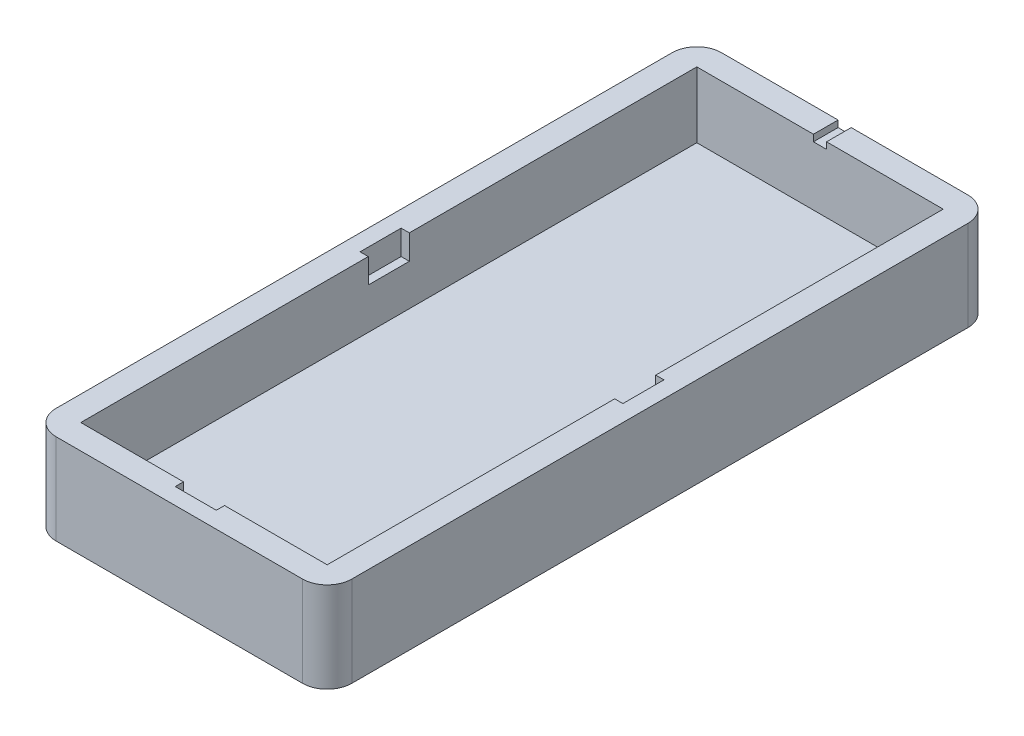
ISO-10303-21;
HEADER;
FILE_DESCRIPTION(('STEP AP214'),'2;1');
FILE_NAME('part.step','',(''),(''),'','','');
FILE_SCHEMA(('AUTOMOTIVE_DESIGN { 1 0 10303 214 1 1 1 1 }'));
ENDSEC;
DATA;
#1=APPLICATION_CONTEXT('core data for automotive mechanical design processes');
#2=APPLICATION_PROTOCOL_DEFINITION('international standard','automotive_design',2000,#1);
#3=PRODUCT_CONTEXT('',#1,'mechanical');
#4=PRODUCT('Part','Part','',(#3));
#5=PRODUCT_RELATED_PRODUCT_CATEGORY('part','',(#4));
#6=PRODUCT_DEFINITION_FORMATION('','',#4);
#7=PRODUCT_DEFINITION_CONTEXT('part definition',#1,'design');
#8=PRODUCT_DEFINITION('design','',#6,#7);
#9=PRODUCT_DEFINITION_SHAPE('','',#8);
#10=(LENGTH_UNIT() NAMED_UNIT(*) SI_UNIT(.MILLI.,.METRE.));
#11=(NAMED_UNIT(*) PLANE_ANGLE_UNIT() SI_UNIT($,.RADIAN.));
#12=(NAMED_UNIT(*) SI_UNIT($,.STERADIAN.) SOLID_ANGLE_UNIT());
#13=UNCERTAINTY_MEASURE_WITH_UNIT(LENGTH_MEASURE(1.E-05),#10,'distance_accuracy_value','');
#14=(GEOMETRIC_REPRESENTATION_CONTEXT(3) GLOBAL_UNCERTAINTY_ASSIGNED_CONTEXT((#13)) GLOBAL_UNIT_ASSIGNED_CONTEXT((#10,
#11,#12)) REPRESENTATION_CONTEXT('',''));
#15=CARTESIAN_POINT('',(0.,0.,0.));
#16=DIRECTION('',(0.,0.,1.));
#17=DIRECTION('',(1.,0.,0.));
#18=AXIS2_PLACEMENT_3D('',#15,#16,#17);
#19=CARTESIAN_POINT('',(0.,11.,0.));
#20=DIRECTION('',(1.,0.,0.));
#21=DIRECTION('',(0.,0.,-1.));
#22=AXIS2_PLACEMENT_3D('',#19,#20,#21);
#23=PLANE('',#22);
#24=DIRECTION('',(0.,0.,1.));
#25=VECTOR('',#24,1.);
#26=CARTESIAN_POINT('',(0.,0.,0.));
#27=LINE('',#26,#25);
#28=CARTESIAN_POINT('',(0.,0.,-78.));
#29=VERTEX_POINT('',#28);
#30=CARTESIAN_POINT('',(0.,0.,-3.));
#31=VERTEX_POINT('',#30);
#32=EDGE_CURVE('E411',#29,#31,#27,.T.);
#33=ORIENTED_EDGE('',*,*,#32,.T.);
#34=DIRECTION('',(0.,-1.,0.));
#35=VECTOR('',#34,1.);
#36=CARTESIAN_POINT('',(0.,11.,-3.));
#37=LINE('',#36,#35);
#38=CARTESIAN_POINT('',(0.,11.,-3.));
#39=VERTEX_POINT('',#38);
#40=EDGE_CURVE('E478',#31,#39,#37,.F.);
#41=ORIENTED_EDGE('',*,*,#40,.T.);
#42=DIRECTION('',(0.,0.,1.));
#43=VECTOR('',#42,1.);
#44=CARTESIAN_POINT('',(0.,11.,0.));
#45=LINE('',#44,#43);
#46=CARTESIAN_POINT('',(0.,11.,-78.));
#47=VERTEX_POINT('',#46);
#48=EDGE_CURVE('E423',#47,#39,#45,.T.);
#49=ORIENTED_EDGE('',*,*,#48,.F.);
#50=DIRECTION('',(0.,-1.,0.));
#51=VECTOR('',#50,1.);
#52=CARTESIAN_POINT('',(0.,11.,-78.));
#53=LINE('',#52,#51);
#54=EDGE_CURVE('E474',#47,#29,#53,.T.);
#55=ORIENTED_EDGE('',*,*,#54,.T.);
#56=EDGE_LOOP('',(#33,#41,#49,#55));
#57=FACE_BOUND('',#56,.T.);
#58=ADVANCED_FACE('F39',(#57),#23,.F.);
#59=CARTESIAN_POINT('',(0.,11.,0.));
#60=DIRECTION('',(0.,0.,-1.));
#61=DIRECTION('',(-1.,0.,0.));
#62=AXIS2_PLACEMENT_3D('',#59,#60,#61);
#63=PLANE('',#62);
#64=DIRECTION('',(1.,0.,0.));
#65=VECTOR('',#64,1.);
#66=CARTESIAN_POINT('',(0.,11.,0.));
#67=LINE('',#66,#65);
#68=CARTESIAN_POINT('',(3.,11.,0.));
#69=VERTEX_POINT('',#68);
#70=CARTESIAN_POINT('',(33.,11.,0.));
#71=VERTEX_POINT('',#70);
#72=EDGE_CURVE('E427',#69,#71,#67,.T.);
#73=ORIENTED_EDGE('',*,*,#72,.F.);
#74=DIRECTION('',(0.,-1.,0.));
#75=VECTOR('',#74,1.);
#76=CARTESIAN_POINT('',(3.,11.,0.));
#77=LINE('',#76,#75);
#78=CARTESIAN_POINT('',(3.,0.,0.));
#79=VERTEX_POINT('',#78);
#80=EDGE_CURVE('E458',#69,#79,#77,.T.);
#81=ORIENTED_EDGE('',*,*,#80,.T.);
#82=DIRECTION('',(1.,0.,0.));
#83=VECTOR('',#82,1.);
#84=CARTESIAN_POINT('',(0.,0.,0.));
#85=LINE('',#84,#83);
#86=CARTESIAN_POINT('',(33.,0.,0.));
#87=VERTEX_POINT('',#86);
#88=EDGE_CURVE('E445',#79,#87,#85,.T.);
#89=ORIENTED_EDGE('',*,*,#88,.T.);
#90=DIRECTION('',(0.,-1.,0.));
#91=VECTOR('',#90,1.);
#92=CARTESIAN_POINT('',(33.,11.,0.));
#93=LINE('',#92,#91);
#94=EDGE_CURVE('E441',#87,#71,#93,.F.);
#95=ORIENTED_EDGE('',*,*,#94,.T.);
#96=EDGE_LOOP('',(#73,#81,#89,#95));
#97=FACE_BOUND('',#96,.T.);
#98=ADVANCED_FACE('F525',(#97),#63,.F.);
#99=CARTESIAN_POINT('',(36.,11.,0.));
#100=DIRECTION('',(-1.,0.,0.));
#101=DIRECTION('',(0.,0.,1.));
#102=AXIS2_PLACEMENT_3D('',#99,#100,#101);
#103=PLANE('',#102);
#104=DIRECTION('',(0.,0.,-1.));
#105=VECTOR('',#104,1.);
#106=CARTESIAN_POINT('',(36.,11.,0.));
#107=LINE('',#106,#105);
#108=CARTESIAN_POINT('',(36.,11.,-3.));
#109=VERTEX_POINT('',#108);
#110=CARTESIAN_POINT('',(36.,11.,-78.));
#111=VERTEX_POINT('',#110);
#112=EDGE_CURVE('E432',#109,#111,#107,.T.);
#113=ORIENTED_EDGE('',*,*,#112,.F.);
#114=DIRECTION('',(0.,-1.,0.));
#115=VECTOR('',#114,1.);
#116=CARTESIAN_POINT('',(36.,11.,-3.));
#117=LINE('',#116,#115);
#118=CARTESIAN_POINT('',(36.,0.,-3.));
#119=VERTEX_POINT('',#118);
#120=EDGE_CURVE('E496',#109,#119,#117,.T.);
#121=ORIENTED_EDGE('',*,*,#120,.T.);
#122=DIRECTION('',(0.,0.,-1.));
#123=VECTOR('',#122,1.);
#124=CARTESIAN_POINT('',(36.,0.,0.));
#125=LINE('',#124,#123);
#126=CARTESIAN_POINT('',(36.,0.,-78.));
#127=VERTEX_POINT('',#126);
#128=EDGE_CURVE('E449',#119,#127,#125,.T.);
#129=ORIENTED_EDGE('',*,*,#128,.T.);
#130=DIRECTION('',(0.,-1.,0.));
#131=VECTOR('',#130,1.);
#132=CARTESIAN_POINT('',(36.,11.,-78.));
#133=LINE('',#132,#131);
#134=EDGE_CURVE('E493',#127,#111,#133,.F.);
#135=ORIENTED_EDGE('',*,*,#134,.T.);
#136=EDGE_LOOP('',(#113,#121,#129,#135));
#137=FACE_BOUND('',#136,.T.);
#138=ADVANCED_FACE('F534',(#137),#103,.F.);
#139=CARTESIAN_POINT('',(0.,11.,-81.));
#140=DIRECTION('',(0.,0.,1.));
#141=DIRECTION('',(1.,0.,0.));
#142=AXIS2_PLACEMENT_3D('',#139,#140,#141);
#143=PLANE('',#142);
#144=DIRECTION('',(-1.,0.,0.));
#145=VECTOR('',#144,1.);
#146=CARTESIAN_POINT('',(0.,11.,-81.));
#147=LINE('',#146,#145);
#148=CARTESIAN_POINT('',(17.2,11.,-81.));
#149=VERTEX_POINT('',#148);
#150=CARTESIAN_POINT('',(3.,11.,-81.));
#151=VERTEX_POINT('',#150);
#152=EDGE_CURVE('E436',#149,#151,#147,.T.);
#153=ORIENTED_EDGE('',*,*,#152,.F.);
#154=DIRECTION('',(0.,1.,0.));
#155=VECTOR('',#154,1.);
#156=CARTESIAN_POINT('',(17.2,10.2,-81.));
#157=LINE('',#156,#155);
#158=CARTESIAN_POINT('',(17.2,10.2,-81.));
#159=VERTEX_POINT('',#158);
#160=EDGE_CURVE('E360',#159,#149,#157,.T.);
#161=ORIENTED_EDGE('',*,*,#160,.F.);
#162=DIRECTION('',(-1.,0.,0.));
#163=VECTOR('',#162,1.);
#164=CARTESIAN_POINT('',(17.2,10.2,-81.));
#165=LINE('',#164,#163);
#166=CARTESIAN_POINT('',(18.8,10.2,-81.));
#167=VERTEX_POINT('',#166);
#168=EDGE_CURVE('E349',#167,#159,#165,.T.);
#169=ORIENTED_EDGE('',*,*,#168,.F.);
#170=DIRECTION('',(0.,1.,0.));
#171=VECTOR('',#170,1.);
#172=CARTESIAN_POINT('',(18.8,10.2,-81.));
#173=LINE('',#172,#171);
#174=CARTESIAN_POINT('',(18.8,11.,-81.));
#175=VERTEX_POINT('',#174);
#176=EDGE_CURVE('E364',#167,#175,#173,.T.);
#177=ORIENTED_EDGE('',*,*,#176,.T.);
#178=CARTESIAN_POINT('',(33.,11.,-81.));
#179=VERTEX_POINT('',#178);
#180=EDGE_CURVE('E437',#179,#175,#147,.T.);
#181=ORIENTED_EDGE('',*,*,#180,.F.);
#182=DIRECTION('',(0.,-1.,0.));
#183=VECTOR('',#182,1.);
#184=CARTESIAN_POINT('',(33.,11.,-81.));
#185=LINE('',#184,#183);
#186=CARTESIAN_POINT('',(33.,0.,-81.));
#187=VERTEX_POINT('',#186);
#188=EDGE_CURVE('E11',#179,#187,#185,.T.);
#189=ORIENTED_EDGE('',*,*,#188,.T.);
#190=DIRECTION('',(-1.,0.,0.));
#191=VECTOR('',#190,1.);
#192=CARTESIAN_POINT('',(0.,0.,-81.));
#193=LINE('',#192,#191);
#194=CARTESIAN_POINT('',(3.,0.,-81.));
#195=VERTEX_POINT('',#194);
#196=EDGE_CURVE('E428',#187,#195,#193,.T.);
#197=ORIENTED_EDGE('',*,*,#196,.T.);
#198=DIRECTION('',(0.,-1.,0.));
#199=VECTOR('',#198,1.);
#200=CARTESIAN_POINT('',(3.,11.,-81.));
#201=LINE('',#200,#199);
#202=EDGE_CURVE('E48',#195,#151,#201,.F.);
#203=ORIENTED_EDGE('',*,*,#202,.T.);
#204=EDGE_LOOP('',(#153,#161,#169,#177,#181,#189,#197,#203));
#205=FACE_BOUND('',#204,.T.);
#206=ADVANCED_FACE('F505',(#205),#143,.F.);
#207=CARTESIAN_POINT('',(0.,11.,0.));
#208=DIRECTION('',(0.,-1.,0.));
#209=DIRECTION('',(0.,0.,-1.));
#210=AXIS2_PLACEMENT_3D('',#207,#208,#209);
#211=PLANE('',#210);
#212=DIRECTION('',(0.,0.,1.));
#213=VECTOR('',#212,1.);
#214=CARTESIAN_POINT('',(3.,11.,-3.));
#215=LINE('',#214,#213);
#216=CARTESIAN_POINT('',(3.,11.,-38.));
#217=VERTEX_POINT('',#216);
#218=CARTESIAN_POINT('',(3.,11.,-3.));
#219=VERTEX_POINT('',#218);
#220=EDGE_CURVE('E363',#217,#219,#215,.T.);
#221=ORIENTED_EDGE('',*,*,#220,.F.);
#222=DIRECTION('',(1.,0.,0.));
#223=VECTOR('',#222,1.);
#224=CARTESIAN_POINT('',(3.,11.,-38.));
#225=LINE('',#224,#223);
#226=CARTESIAN_POINT('',(2.,11.,-38.));
#227=VERTEX_POINT('',#226);
#228=EDGE_CURVE('E245',#227,#217,#225,.T.);
#229=ORIENTED_EDGE('',*,*,#228,.F.);
#230=DIRECTION('',(0.,0.,1.));
#231=VECTOR('',#230,1.);
#232=CARTESIAN_POINT('',(2.,11.,-43.));
#233=LINE('',#232,#231);
#234=CARTESIAN_POINT('',(2.,11.,-43.));
#235=VERTEX_POINT('',#234);
#236=EDGE_CURVE('E569',#235,#227,#233,.T.);
#237=ORIENTED_EDGE('',*,*,#236,.F.);
#238=DIRECTION('',(-1.,0.,0.));
#239=VECTOR('',#238,1.);
#240=CARTESIAN_POINT('',(3.,11.,-43.));
#241=LINE('',#240,#239);
#242=CARTESIAN_POINT('',(3.,11.,-43.));
#243=VERTEX_POINT('',#242);
#244=EDGE_CURVE('E290',#243,#235,#241,.T.);
#245=ORIENTED_EDGE('',*,*,#244,.F.);
#246=CARTESIAN_POINT('',(3.,11.,-78.));
#247=VERTEX_POINT('',#246);
#248=EDGE_CURVE('E251',#247,#243,#215,.T.);
#249=ORIENTED_EDGE('',*,*,#248,.F.);
#250=DIRECTION('',(-1.,0.,0.));
#251=VECTOR('',#250,1.);
#252=CARTESIAN_POINT('',(3.,11.,-78.));
#253=LINE('',#252,#251);
#254=CARTESIAN_POINT('',(17.2,11.,-78.));
#255=VERTEX_POINT('',#254);
#256=EDGE_CURVE('E404',#255,#247,#253,.T.);
#257=ORIENTED_EDGE('',*,*,#256,.F.);
#258=DIRECTION('',(0.,0.,1.));
#259=VECTOR('',#258,1.);
#260=CARTESIAN_POINT('',(17.2,11.,-81.));
#261=LINE('',#260,#259);
#262=EDGE_CURVE('E354',#149,#255,#261,.T.);
#263=ORIENTED_EDGE('',*,*,#262,.F.);
#264=ORIENTED_EDGE('',*,*,#152,.T.);
#265=CARTESIAN_POINT('',(3.,11.,-78.));
#266=DIRECTION('',(0.,-1.,0.));
#267=DIRECTION('',(0.,0.,-1.));
#268=AXIS2_PLACEMENT_3D('',#265,#266,#267);
#269=CIRCLE('',#268,3.);
#270=EDGE_CURVE('E481',#151,#47,#269,.F.);
#271=ORIENTED_EDGE('',*,*,#270,.T.);
#272=ORIENTED_EDGE('',*,*,#48,.T.);
#273=CARTESIAN_POINT('',(3.,11.,-3.));
#274=DIRECTION('',(0.,-1.,0.));
#275=DIRECTION('',(0.,0.,-1.));
#276=AXIS2_PLACEMENT_3D('',#273,#274,#275);
#277=CIRCLE('',#276,3.);
#278=EDGE_CURVE('E490',#39,#69,#277,.F.);
#279=ORIENTED_EDGE('',*,*,#278,.T.);
#280=ORIENTED_EDGE('',*,*,#72,.T.);
#281=CARTESIAN_POINT('',(33.,11.,-3.));
#282=DIRECTION('',(0.,-1.,0.));
#283=DIRECTION('',(0.,0.,-1.));
#284=AXIS2_PLACEMENT_3D('',#281,#282,#283);
#285=CIRCLE('',#284,3.);
#286=EDGE_CURVE('E487',#71,#109,#285,.F.);
#287=ORIENTED_EDGE('',*,*,#286,.T.);
#288=ORIENTED_EDGE('',*,*,#112,.T.);
#289=CARTESIAN_POINT('',(33.,11.,-78.));
#290=DIRECTION('',(0.,-1.,0.));
#291=DIRECTION('',(0.,0.,-1.));
#292=AXIS2_PLACEMENT_3D('',#289,#290,#291);
#293=CIRCLE('',#292,3.);
#294=EDGE_CURVE('E484',#111,#179,#293,.F.);
#295=ORIENTED_EDGE('',*,*,#294,.T.);
#296=ORIENTED_EDGE('',*,*,#180,.T.);
#297=DIRECTION('',(0.,0.,-1.));
#298=VECTOR('',#297,1.);
#299=CARTESIAN_POINT('',(18.8,11.,-81.));
#300=LINE('',#299,#298);
#301=CARTESIAN_POINT('',(18.8,11.,-78.));
#302=VERTEX_POINT('',#301);
#303=EDGE_CURVE('E341',#302,#175,#300,.T.);
#304=ORIENTED_EDGE('',*,*,#303,.F.);
#305=CARTESIAN_POINT('',(33.,11.,-78.));
#306=VERTEX_POINT('',#305);
#307=EDGE_CURVE('E379',#306,#302,#253,.T.);
#308=ORIENTED_EDGE('',*,*,#307,.F.);
#309=DIRECTION('',(0.,0.,-1.));
#310=VECTOR('',#309,1.);
#311=CARTESIAN_POINT('',(33.,11.,-3.));
#312=LINE('',#311,#310);
#313=CARTESIAN_POINT('',(33.,11.,-43.));
#314=VERTEX_POINT('',#313);
#315=EDGE_CURVE('E399',#314,#306,#312,.T.);
#316=ORIENTED_EDGE('',*,*,#315,.F.);
#317=DIRECTION('',(-1.,0.,0.));
#318=VECTOR('',#317,1.);
#319=CARTESIAN_POINT('',(33.,11.,-43.));
#320=LINE('',#319,#318);
#321=CARTESIAN_POINT('',(34.,11.,-43.));
#322=VERTEX_POINT('',#321);
#323=EDGE_CURVE('E265',#322,#314,#320,.T.);
#324=ORIENTED_EDGE('',*,*,#323,.F.);
#325=DIRECTION('',(0.,0.,-1.));
#326=VECTOR('',#325,1.);
#327=CARTESIAN_POINT('',(34.,11.,-43.));
#328=LINE('',#327,#326);
#329=CARTESIAN_POINT('',(34.,11.,-38.));
#330=VERTEX_POINT('',#329);
#331=EDGE_CURVE('E279',#330,#322,#328,.T.);
#332=ORIENTED_EDGE('',*,*,#331,.F.);
#333=DIRECTION('',(1.,0.,0.));
#334=VECTOR('',#333,1.);
#335=CARTESIAN_POINT('',(33.,11.,-38.));
#336=LINE('',#335,#334);
#337=CARTESIAN_POINT('',(33.,11.,-38.));
#338=VERTEX_POINT('',#337);
#339=EDGE_CURVE('E275',#338,#330,#336,.T.);
#340=ORIENTED_EDGE('',*,*,#339,.F.);
#341=CARTESIAN_POINT('',(33.,11.,-3.));
#342=VERTEX_POINT('',#341);
#343=EDGE_CURVE('E400',#342,#338,#312,.T.);
#344=ORIENTED_EDGE('',*,*,#343,.F.);
#345=DIRECTION('',(1.,0.,0.));
#346=VECTOR('',#345,1.);
#347=CARTESIAN_POINT('',(3.,11.,-3.));
#348=LINE('',#347,#346);
#349=CARTESIAN_POINT('',(20.5,11.,-3.));
#350=VERTEX_POINT('',#349);
#351=EDGE_CURVE('E394',#350,#342,#348,.T.);
#352=ORIENTED_EDGE('',*,*,#351,.F.);
#353=DIRECTION('',(0.,0.,-1.));
#354=VECTOR('',#353,1.);
#355=CARTESIAN_POINT('',(20.5,11.,-3.));
#356=LINE('',#355,#354);
#357=CARTESIAN_POINT('',(20.5,11.,-2.));
#358=VERTEX_POINT('',#357);
#359=EDGE_CURVE('E304',#358,#350,#356,.T.);
#360=ORIENTED_EDGE('',*,*,#359,.F.);
#361=DIRECTION('',(1.,0.,0.));
#362=VECTOR('',#361,1.);
#363=CARTESIAN_POINT('',(15.5,11.,-2.));
#364=LINE('',#363,#362);
#365=CARTESIAN_POINT('',(15.5,11.,-2.));
#366=VERTEX_POINT('',#365);
#367=EDGE_CURVE('E320',#366,#358,#364,.T.);
#368=ORIENTED_EDGE('',*,*,#367,.F.);
#369=DIRECTION('',(0.,0.,1.));
#370=VECTOR('',#369,1.);
#371=CARTESIAN_POINT('',(15.5,11.,-3.));
#372=LINE('',#371,#370);
#373=CARTESIAN_POINT('',(15.5,11.,-3.));
#374=VERTEX_POINT('',#373);
#375=EDGE_CURVE('E316',#374,#366,#372,.T.);
#376=ORIENTED_EDGE('',*,*,#375,.F.);
#377=EDGE_CURVE('E395',#219,#374,#348,.T.);
#378=ORIENTED_EDGE('',*,*,#377,.F.);
#379=EDGE_LOOP('',(#221,#229,#237,#245,#249,#257,#263,#264,#271,#272,#279,#280,#287,#288,#295,
#296,#304,#308,#316,#324,#332,#340,#344,#352,#360,#368,#376,#378));
#380=FACE_BOUND('',#379,.T.);
#381=ADVANCED_FACE('F513',(#380),#211,.F.);
#382=CARTESIAN_POINT('',(0.,0.,0.));
#383=DIRECTION('',(0.,-1.,0.));
#384=DIRECTION('',(0.,0.,-1.));
#385=AXIS2_PLACEMENT_3D('',#382,#383,#384);
#386=PLANE('',#385);
#387=ORIENTED_EDGE('',*,*,#88,.F.);
#388=CARTESIAN_POINT('',(3.,0.,-3.));
#389=DIRECTION('',(0.,-1.,0.));
#390=DIRECTION('',(0.,0.,-1.));
#391=AXIS2_PLACEMENT_3D('',#388,#389,#390);
#392=CIRCLE('',#391,3.);
#393=EDGE_CURVE('E471',#79,#31,#392,.T.);
#394=ORIENTED_EDGE('',*,*,#393,.T.);
#395=ORIENTED_EDGE('',*,*,#32,.F.);
#396=CARTESIAN_POINT('',(3.,0.,-78.));
#397=DIRECTION('',(0.,-1.,0.));
#398=DIRECTION('',(0.,0.,-1.));
#399=AXIS2_PLACEMENT_3D('',#396,#397,#398);
#400=CIRCLE('',#399,3.);
#401=EDGE_CURVE('E462',#29,#195,#400,.T.);
#402=ORIENTED_EDGE('',*,*,#401,.T.);
#403=ORIENTED_EDGE('',*,*,#196,.F.);
#404=CARTESIAN_POINT('',(33.,0.,-78.));
#405=DIRECTION('',(0.,-1.,0.));
#406=DIRECTION('',(0.,0.,-1.));
#407=AXIS2_PLACEMENT_3D('',#404,#405,#406);
#408=CIRCLE('',#407,3.);
#409=EDGE_CURVE('E465',#187,#127,#408,.T.);
#410=ORIENTED_EDGE('',*,*,#409,.T.);
#411=ORIENTED_EDGE('',*,*,#128,.F.);
#412=CARTESIAN_POINT('',(33.,0.,-3.));
#413=DIRECTION('',(0.,-1.,0.));
#414=DIRECTION('',(0.,0.,-1.));
#415=AXIS2_PLACEMENT_3D('',#412,#413,#414);
#416=CIRCLE('',#415,3.);
#417=EDGE_CURVE('E468',#119,#87,#416,.T.);
#418=ORIENTED_EDGE('',*,*,#417,.T.);
#419=EDGE_LOOP('',(#387,#394,#395,#402,#403,#410,#411,#418));
#420=FACE_BOUND('',#419,.T.);
#421=ADVANCED_FACE('F642',(#420),#386,.T.);
#422=CARTESIAN_POINT('',(3.,3.,-3.));
#423=DIRECTION('',(-1.,0.,0.));
#424=DIRECTION('',(0.,0.,1.));
#425=AXIS2_PLACEMENT_3D('',#422,#423,#424);
#426=PLANE('',#425);
#427=DIRECTION('',(0.,0.,-1.));
#428=VECTOR('',#427,1.);
#429=CARTESIAN_POINT('',(3.,8.,-43.));
#430=LINE('',#429,#428);
#431=CARTESIAN_POINT('',(3.,8.,-38.));
#432=VERTEX_POINT('',#431);
#433=CARTESIAN_POINT('',(3.,8.,-43.));
#434=VERTEX_POINT('',#433);
#435=EDGE_CURVE('E238',#432,#434,#430,.T.);
#436=ORIENTED_EDGE('',*,*,#435,.F.);
#437=DIRECTION('',(0.,1.,0.));
#438=VECTOR('',#437,1.);
#439=CARTESIAN_POINT('',(3.,8.,-38.));
#440=LINE('',#439,#438);
#441=EDGE_CURVE('E357',#432,#217,#440,.T.);
#442=ORIENTED_EDGE('',*,*,#441,.T.);
#443=ORIENTED_EDGE('',*,*,#220,.T.);
#444=DIRECTION('',(0.,1.,0.));
#445=VECTOR('',#444,1.);
#446=CARTESIAN_POINT('',(3.,3.,-3.));
#447=LINE('',#446,#445);
#448=CARTESIAN_POINT('',(3.,3.,-3.));
#449=VERTEX_POINT('',#448);
#450=EDGE_CURVE('E391',#449,#219,#447,.T.);
#451=ORIENTED_EDGE('',*,*,#450,.F.);
#452=DIRECTION('',(0.,0.,1.));
#453=VECTOR('',#452,1.);
#454=CARTESIAN_POINT('',(3.,3.,-3.));
#455=LINE('',#454,#453);
#456=CARTESIAN_POINT('',(3.,3.,-78.));
#457=VERTEX_POINT('',#456);
#458=EDGE_CURVE('E374',#457,#449,#455,.T.);
#459=ORIENTED_EDGE('',*,*,#458,.F.);
#460=DIRECTION('',(0.,1.,0.));
#461=VECTOR('',#460,1.);
#462=CARTESIAN_POINT('',(3.,3.,-78.));
#463=LINE('',#462,#461);
#464=EDGE_CURVE('E408',#457,#247,#463,.T.);
#465=ORIENTED_EDGE('',*,*,#464,.T.);
#466=ORIENTED_EDGE('',*,*,#248,.T.);
#467=DIRECTION('',(0.,1.,0.));
#468=VECTOR('',#467,1.);
#469=CARTESIAN_POINT('',(3.,8.,-43.));
#470=LINE('',#469,#468);
#471=EDGE_CURVE('E232',#434,#243,#470,.T.);
#472=ORIENTED_EDGE('',*,*,#471,.F.);
#473=EDGE_LOOP('',(#436,#442,#443,#451,#459,#465,#466,#472));
#474=FACE_BOUND('',#473,.T.);
#475=ADVANCED_FACE('F248',(#474),#426,.F.);
#476=CARTESIAN_POINT('',(3.,3.,-78.));
#477=DIRECTION('',(0.,0.,-1.));
#478=DIRECTION('',(-1.,0.,0.));
#479=AXIS2_PLACEMENT_3D('',#476,#477,#478);
#480=PLANE('',#479);
#481=DIRECTION('',(1.,0.,0.));
#482=VECTOR('',#481,1.);
#483=CARTESIAN_POINT('',(17.2,10.2,-78.));
#484=LINE('',#483,#482);
#485=CARTESIAN_POINT('',(17.2,10.2,-78.));
#486=VERTEX_POINT('',#485);
#487=CARTESIAN_POINT('',(18.8,10.2,-78.));
#488=VERTEX_POINT('',#487);
#489=EDGE_CURVE('E340',#486,#488,#484,.T.);
#490=ORIENTED_EDGE('',*,*,#489,.F.);
#491=DIRECTION('',(0.,1.,0.));
#492=VECTOR('',#491,1.);
#493=CARTESIAN_POINT('',(17.2,10.2,-78.));
#494=LINE('',#493,#492);
#495=EDGE_CURVE('E353',#486,#255,#494,.T.);
#496=ORIENTED_EDGE('',*,*,#495,.T.);
#497=ORIENTED_EDGE('',*,*,#256,.T.);
#498=ORIENTED_EDGE('',*,*,#464,.F.);
#499=DIRECTION('',(-1.,0.,0.));
#500=VECTOR('',#499,1.);
#501=CARTESIAN_POINT('',(3.,3.,-78.));
#502=LINE('',#501,#500);
#503=CARTESIAN_POINT('',(33.,3.,-78.));
#504=VERTEX_POINT('',#503);
#505=EDGE_CURVE('E387',#504,#457,#502,.T.);
#506=ORIENTED_EDGE('',*,*,#505,.F.);
#507=DIRECTION('',(0.,1.,0.));
#508=VECTOR('',#507,1.);
#509=CARTESIAN_POINT('',(33.,3.,-78.));
#510=LINE('',#509,#508);
#511=EDGE_CURVE('E412',#504,#306,#510,.T.);
#512=ORIENTED_EDGE('',*,*,#511,.T.);
#513=ORIENTED_EDGE('',*,*,#307,.T.);
#514=DIRECTION('',(0.,1.,0.));
#515=VECTOR('',#514,1.);
#516=CARTESIAN_POINT('',(18.8,10.2,-78.));
#517=LINE('',#516,#515);
#518=EDGE_CURVE('E368',#488,#302,#517,.T.);
#519=ORIENTED_EDGE('',*,*,#518,.F.);
#520=EDGE_LOOP('',(#490,#496,#497,#498,#506,#512,#513,#519));
#521=FACE_BOUND('',#520,.T.);
#522=ADVANCED_FACE('F551',(#521),#480,.F.);
#523=CARTESIAN_POINT('',(33.,3.,-3.));
#524=DIRECTION('',(1.,0.,0.));
#525=DIRECTION('',(0.,0.,-1.));
#526=AXIS2_PLACEMENT_3D('',#523,#524,#525);
#527=PLANE('',#526);
#528=DIRECTION('',(0.,0.,1.));
#529=VECTOR('',#528,1.);
#530=CARTESIAN_POINT('',(33.,8.,-43.));
#531=LINE('',#530,#529);
#532=CARTESIAN_POINT('',(33.,8.,-43.));
#533=VERTEX_POINT('',#532);
#534=CARTESIAN_POINT('',(33.,8.,-38.));
#535=VERTEX_POINT('',#534);
#536=EDGE_CURVE('E261',#533,#535,#531,.T.);
#537=ORIENTED_EDGE('',*,*,#536,.F.);
#538=DIRECTION('',(0.,1.,0.));
#539=VECTOR('',#538,1.);
#540=CARTESIAN_POINT('',(33.,8.,-43.));
#541=LINE('',#540,#539);
#542=EDGE_CURVE('E286',#533,#314,#541,.T.);
#543=ORIENTED_EDGE('',*,*,#542,.T.);
#544=ORIENTED_EDGE('',*,*,#315,.T.);
#545=ORIENTED_EDGE('',*,*,#511,.F.);
#546=DIRECTION('',(0.,0.,-1.));
#547=VECTOR('',#546,1.);
#548=CARTESIAN_POINT('',(33.,3.,-3.));
#549=LINE('',#548,#547);
#550=CARTESIAN_POINT('',(33.,3.,-3.));
#551=VERTEX_POINT('',#550);
#552=EDGE_CURVE('E383',#551,#504,#549,.T.);
#553=ORIENTED_EDGE('',*,*,#552,.F.);
#554=DIRECTION('',(0.,1.,0.));
#555=VECTOR('',#554,1.);
#556=CARTESIAN_POINT('',(33.,3.,-3.));
#557=LINE('',#556,#555);
#558=EDGE_CURVE('E416',#551,#342,#557,.T.);
#559=ORIENTED_EDGE('',*,*,#558,.T.);
#560=ORIENTED_EDGE('',*,*,#343,.T.);
#561=DIRECTION('',(0.,1.,0.));
#562=VECTOR('',#561,1.);
#563=CARTESIAN_POINT('',(33.,8.,-38.));
#564=LINE('',#563,#562);
#565=EDGE_CURVE('E274',#535,#338,#564,.T.);
#566=ORIENTED_EDGE('',*,*,#565,.F.);
#567=EDGE_LOOP('',(#537,#543,#544,#545,#553,#559,#560,#566));
#568=FACE_BOUND('',#567,.T.);
#569=ADVANCED_FACE('F635',(#568),#527,.F.);
#570=CARTESIAN_POINT('',(3.,3.,-3.));
#571=DIRECTION('',(0.,0.,1.));
#572=DIRECTION('',(1.,0.,0.));
#573=AXIS2_PLACEMENT_3D('',#570,#571,#572);
#574=PLANE('',#573);
#575=ORIENTED_EDGE('',*,*,#377,.T.);
#576=DIRECTION('',(0.,1.,0.));
#577=VECTOR('',#576,1.);
#578=CARTESIAN_POINT('',(15.5,8.,-3.));
#579=LINE('',#578,#577);
#580=CARTESIAN_POINT('',(15.5,8.,-3.));
#581=VERTEX_POINT('',#580);
#582=EDGE_CURVE('E280',#581,#374,#579,.T.);
#583=ORIENTED_EDGE('',*,*,#582,.F.);
#584=DIRECTION('',(-1.,0.,0.));
#585=VECTOR('',#584,1.);
#586=CARTESIAN_POINT('',(15.5,8.,-3.));
#587=LINE('',#586,#585);
#588=CARTESIAN_POINT('',(20.5,8.,-3.));
#589=VERTEX_POINT('',#588);
#590=EDGE_CURVE('E311',#589,#581,#587,.T.);
#591=ORIENTED_EDGE('',*,*,#590,.F.);
#592=DIRECTION('',(0.,1.,0.));
#593=VECTOR('',#592,1.);
#594=CARTESIAN_POINT('',(20.5,8.,-3.));
#595=LINE('',#594,#593);
#596=EDGE_CURVE('E328',#589,#350,#595,.T.);
#597=ORIENTED_EDGE('',*,*,#596,.T.);
#598=ORIENTED_EDGE('',*,*,#351,.T.);
#599=ORIENTED_EDGE('',*,*,#558,.F.);
#600=DIRECTION('',(1.,0.,0.));
#601=VECTOR('',#600,1.);
#602=CARTESIAN_POINT('',(3.,3.,-3.));
#603=LINE('',#602,#601);
#604=EDGE_CURVE('E378',#449,#551,#603,.T.);
#605=ORIENTED_EDGE('',*,*,#604,.F.);
#606=ORIENTED_EDGE('',*,*,#450,.T.);
#607=EDGE_LOOP('',(#575,#583,#591,#597,#598,#599,#605,#606));
#608=FACE_BOUND('',#607,.T.);
#609=ADVANCED_FACE('F584',(#608),#574,.F.);
#610=CARTESIAN_POINT('',(0.,3.,0.));
#611=DIRECTION('',(0.,-1.,0.));
#612=DIRECTION('',(0.,0.,-1.));
#613=AXIS2_PLACEMENT_3D('',#610,#611,#612);
#614=PLANE('',#613);
#615=ORIENTED_EDGE('',*,*,#458,.T.);
#616=ORIENTED_EDGE('',*,*,#604,.T.);
#617=ORIENTED_EDGE('',*,*,#552,.T.);
#618=ORIENTED_EDGE('',*,*,#505,.T.);
#619=EDGE_LOOP('',(#615,#616,#617,#618));
#620=FACE_BOUND('',#619,.T.);
#621=ADVANCED_FACE('F590',(#620),#614,.F.);
#622=CARTESIAN_POINT('',(3.,11.,-3.));
#623=DIRECTION('',(0.,-1.,0.));
#624=DIRECTION('',(0.,0.,-1.));
#625=AXIS2_PLACEMENT_3D('',#622,#623,#624);
#626=CYLINDRICAL_SURFACE('',#625,3.);
#627=ORIENTED_EDGE('',*,*,#278,.F.);
#628=ORIENTED_EDGE('',*,*,#40,.F.);
#629=ORIENTED_EDGE('',*,*,#393,.F.);
#630=ORIENTED_EDGE('',*,*,#80,.F.);
#631=EDGE_LOOP('',(#627,#628,#629,#630));
#632=FACE_BOUND('',#631,.T.);
#633=ADVANCED_FACE('F520',(#632),#626,.T.);
#634=CARTESIAN_POINT('',(33.,11.,-3.));
#635=DIRECTION('',(0.,-1.,0.));
#636=DIRECTION('',(0.,0.,-1.));
#637=AXIS2_PLACEMENT_3D('',#634,#635,#636);
#638=CYLINDRICAL_SURFACE('',#637,3.);
#639=ORIENTED_EDGE('',*,*,#286,.F.);
#640=ORIENTED_EDGE('',*,*,#94,.F.);
#641=ORIENTED_EDGE('',*,*,#417,.F.);
#642=ORIENTED_EDGE('',*,*,#120,.F.);
#643=EDGE_LOOP('',(#639,#640,#641,#642));
#644=FACE_BOUND('',#643,.T.);
#645=ADVANCED_FACE('F529',(#644),#638,.T.);
#646=CARTESIAN_POINT('',(33.,11.,-78.));
#647=DIRECTION('',(0.,-1.,0.));
#648=DIRECTION('',(0.,0.,-1.));
#649=AXIS2_PLACEMENT_3D('',#646,#647,#648);
#650=CYLINDRICAL_SURFACE('',#649,3.);
#651=ORIENTED_EDGE('',*,*,#294,.F.);
#652=ORIENTED_EDGE('',*,*,#134,.F.);
#653=ORIENTED_EDGE('',*,*,#409,.F.);
#654=ORIENTED_EDGE('',*,*,#188,.F.);
#655=EDGE_LOOP('',(#651,#652,#653,#654));
#656=FACE_BOUND('',#655,.T.);
#657=ADVANCED_FACE('F538',(#656),#650,.T.);
#658=CARTESIAN_POINT('',(3.,11.,-78.));
#659=DIRECTION('',(0.,-1.,0.));
#660=DIRECTION('',(0.,0.,-1.));
#661=AXIS2_PLACEMENT_3D('',#658,#659,#660);
#662=CYLINDRICAL_SURFACE('',#661,3.);
#663=ORIENTED_EDGE('',*,*,#270,.F.);
#664=ORIENTED_EDGE('',*,*,#202,.F.);
#665=ORIENTED_EDGE('',*,*,#401,.F.);
#666=ORIENTED_EDGE('',*,*,#54,.F.);
#667=EDGE_LOOP('',(#663,#664,#665,#666));
#668=FACE_BOUND('',#667,.T.);
#669=ADVANCED_FACE('F41',(#668),#662,.T.);
#670=CARTESIAN_POINT('',(17.2,10.2,-81.));
#671=DIRECTION('',(-1.,0.,0.));
#672=DIRECTION('',(0.,0.,1.));
#673=AXIS2_PLACEMENT_3D('',#670,#671,#672);
#674=PLANE('',#673);
#675=ORIENTED_EDGE('',*,*,#262,.T.);
#676=ORIENTED_EDGE('',*,*,#495,.F.);
#677=DIRECTION('',(0.,0.,1.));
#678=VECTOR('',#677,1.);
#679=CARTESIAN_POINT('',(17.2,10.2,-81.));
#680=LINE('',#679,#678);
#681=EDGE_CURVE('E337',#159,#486,#680,.T.);
#682=ORIENTED_EDGE('',*,*,#681,.F.);
#683=ORIENTED_EDGE('',*,*,#160,.T.);
#684=EDGE_LOOP('',(#675,#676,#682,#683));
#685=FACE_BOUND('',#684,.T.);
#686=ADVANCED_FACE('F619',(#685),#674,.F.);
#687=CARTESIAN_POINT('',(18.8,10.2,-81.));
#688=DIRECTION('',(1.,0.,0.));
#689=DIRECTION('',(0.,0.,-1.));
#690=AXIS2_PLACEMENT_3D('',#687,#688,#689);
#691=PLANE('',#690);
#692=ORIENTED_EDGE('',*,*,#303,.T.);
#693=ORIENTED_EDGE('',*,*,#176,.F.);
#694=DIRECTION('',(0.,0.,-1.));
#695=VECTOR('',#694,1.);
#696=CARTESIAN_POINT('',(18.8,10.2,-81.));
#697=LINE('',#696,#695);
#698=EDGE_CURVE('E345',#488,#167,#697,.T.);
#699=ORIENTED_EDGE('',*,*,#698,.F.);
#700=ORIENTED_EDGE('',*,*,#518,.T.);
#701=EDGE_LOOP('',(#692,#693,#699,#700));
#702=FACE_BOUND('',#701,.T.);
#703=ADVANCED_FACE('F544',(#702),#691,.F.);
#704=CARTESIAN_POINT('',(0.,10.2,0.));
#705=DIRECTION('',(0.,1.,0.));
#706=DIRECTION('',(0.,0.,1.));
#707=AXIS2_PLACEMENT_3D('',#704,#705,#706);
#708=PLANE('',#707);
#709=ORIENTED_EDGE('',*,*,#681,.T.);
#710=ORIENTED_EDGE('',*,*,#489,.T.);
#711=ORIENTED_EDGE('',*,*,#698,.T.);
#712=ORIENTED_EDGE('',*,*,#168,.T.);
#713=EDGE_LOOP('',(#709,#710,#711,#712));
#714=FACE_BOUND('',#713,.T.);
#715=ADVANCED_FACE('F546',(#714),#708,.T.);
#716=CARTESIAN_POINT('',(15.5,8.,-3.));
#717=DIRECTION('',(-1.,0.,0.));
#718=DIRECTION('',(0.,0.,1.));
#719=AXIS2_PLACEMENT_3D('',#716,#717,#718);
#720=PLANE('',#719);
#721=ORIENTED_EDGE('',*,*,#375,.T.);
#722=DIRECTION('',(0.,1.,0.));
#723=VECTOR('',#722,1.);
#724=CARTESIAN_POINT('',(15.5,8.,-2.));
#725=LINE('',#724,#723);
#726=CARTESIAN_POINT('',(15.5,8.,-2.));
#727=VERTEX_POINT('',#726);
#728=EDGE_CURVE('E315',#727,#366,#725,.T.);
#729=ORIENTED_EDGE('',*,*,#728,.F.);
#730=DIRECTION('',(0.,0.,1.));
#731=VECTOR('',#730,1.);
#732=CARTESIAN_POINT('',(15.5,8.,-3.));
#733=LINE('',#732,#731);
#734=EDGE_CURVE('E299',#581,#727,#733,.T.);
#735=ORIENTED_EDGE('',*,*,#734,.F.);
#736=ORIENTED_EDGE('',*,*,#582,.T.);
#737=EDGE_LOOP('',(#721,#729,#735,#736));
#738=FACE_BOUND('',#737,.T.);
#739=ADVANCED_FACE('F722',(#738),#720,.F.);
#740=CARTESIAN_POINT('',(20.5,8.,-3.));
#741=DIRECTION('',(1.,0.,0.));
#742=DIRECTION('',(0.,0.,-1.));
#743=AXIS2_PLACEMENT_3D('',#740,#741,#742);
#744=PLANE('',#743);
#745=ORIENTED_EDGE('',*,*,#359,.T.);
#746=ORIENTED_EDGE('',*,*,#596,.F.);
#747=DIRECTION('',(0.,0.,-1.));
#748=VECTOR('',#747,1.);
#749=CARTESIAN_POINT('',(20.5,8.,-3.));
#750=LINE('',#749,#748);
#751=CARTESIAN_POINT('',(20.5,8.,-2.));
#752=VERTEX_POINT('',#751);
#753=EDGE_CURVE('E308',#752,#589,#750,.T.);
#754=ORIENTED_EDGE('',*,*,#753,.F.);
#755=DIRECTION('',(0.,1.,0.));
#756=VECTOR('',#755,1.);
#757=CARTESIAN_POINT('',(20.5,8.,-2.));
#758=LINE('',#757,#756);
#759=EDGE_CURVE('E332',#752,#358,#758,.T.);
#760=ORIENTED_EDGE('',*,*,#759,.T.);
#761=EDGE_LOOP('',(#745,#746,#754,#760));
#762=FACE_BOUND('',#761,.T.);
#763=ADVANCED_FACE('F728',(#762),#744,.F.);
#764=CARTESIAN_POINT('',(15.5,8.,-2.));
#765=DIRECTION('',(0.,0.,1.));
#766=DIRECTION('',(1.,0.,0.));
#767=AXIS2_PLACEMENT_3D('',#764,#765,#766);
#768=PLANE('',#767);
#769=ORIENTED_EDGE('',*,*,#367,.T.);
#770=ORIENTED_EDGE('',*,*,#759,.F.);
#771=DIRECTION('',(1.,0.,0.));
#772=VECTOR('',#771,1.);
#773=CARTESIAN_POINT('',(15.5,8.,-2.));
#774=LINE('',#773,#772);
#775=EDGE_CURVE('E303',#727,#752,#774,.T.);
#776=ORIENTED_EDGE('',*,*,#775,.F.);
#777=ORIENTED_EDGE('',*,*,#728,.T.);
#778=EDGE_LOOP('',(#769,#770,#776,#777));
#779=FACE_BOUND('',#778,.T.);
#780=ADVANCED_FACE('F737',(#779),#768,.F.);
#781=CARTESIAN_POINT('',(0.,8.,0.));
#782=DIRECTION('',(0.,1.,0.));
#783=DIRECTION('',(0.,0.,1.));
#784=AXIS2_PLACEMENT_3D('',#781,#782,#783);
#785=PLANE('',#784);
#786=ORIENTED_EDGE('',*,*,#734,.T.);
#787=ORIENTED_EDGE('',*,*,#775,.T.);
#788=ORIENTED_EDGE('',*,*,#753,.T.);
#789=ORIENTED_EDGE('',*,*,#590,.T.);
#790=EDGE_LOOP('',(#786,#787,#788,#789));
#791=FACE_BOUND('',#790,.T.);
#792=ADVANCED_FACE('F746',(#791),#785,.T.);
#793=CARTESIAN_POINT('',(33.,8.,-43.));
#794=DIRECTION('',(0.,0.,-1.));
#795=DIRECTION('',(-1.,0.,0.));
#796=AXIS2_PLACEMENT_3D('',#793,#794,#795);
#797=PLANE('',#796);
#798=ORIENTED_EDGE('',*,*,#323,.T.);
#799=ORIENTED_EDGE('',*,*,#542,.F.);
#800=DIRECTION('',(-1.,0.,0.));
#801=VECTOR('',#800,1.);
#802=CARTESIAN_POINT('',(33.,8.,-43.));
#803=LINE('',#802,#801);
#804=CARTESIAN_POINT('',(34.,8.,-43.));
#805=VERTEX_POINT('',#804);
#806=EDGE_CURVE('E63',#805,#533,#803,.T.);
#807=ORIENTED_EDGE('',*,*,#806,.F.);
#808=DIRECTION('',(0.,1.,0.));
#809=VECTOR('',#808,1.);
#810=CARTESIAN_POINT('',(34.,8.,-43.));
#811=LINE('',#810,#809);
#812=EDGE_CURVE('E291',#805,#322,#811,.T.);
#813=ORIENTED_EDGE('',*,*,#812,.T.);
#814=EDGE_LOOP('',(#798,#799,#807,#813));
#815=FACE_BOUND('',#814,.T.);
#816=ADVANCED_FACE('F755',(#815),#797,.F.);
#817=CARTESIAN_POINT('',(34.,8.,-43.));
#818=DIRECTION('',(1.,0.,0.));
#819=DIRECTION('',(0.,0.,-1.));
#820=AXIS2_PLACEMENT_3D('',#817,#818,#819);
#821=PLANE('',#820);
#822=ORIENTED_EDGE('',*,*,#331,.T.);
#823=ORIENTED_EDGE('',*,*,#812,.F.);
#824=DIRECTION('',(0.,0.,-1.));
#825=VECTOR('',#824,1.);
#826=CARTESIAN_POINT('',(34.,8.,-43.));
#827=LINE('',#826,#825);
#828=CARTESIAN_POINT('',(34.,8.,-38.));
#829=VERTEX_POINT('',#828);
#830=EDGE_CURVE('E269',#829,#805,#827,.T.);
#831=ORIENTED_EDGE('',*,*,#830,.F.);
#832=DIRECTION('',(0.,1.,0.));
#833=VECTOR('',#832,1.);
#834=CARTESIAN_POINT('',(34.,8.,-38.));
#835=LINE('',#834,#833);
#836=EDGE_CURVE('E294',#829,#330,#835,.T.);
#837=ORIENTED_EDGE('',*,*,#836,.T.);
#838=EDGE_LOOP('',(#822,#823,#831,#837));
#839=FACE_BOUND('',#838,.T.);
#840=ADVANCED_FACE('F764',(#839),#821,.F.);
#841=CARTESIAN_POINT('',(33.,8.,-38.));
#842=DIRECTION('',(0.,0.,1.));
#843=DIRECTION('',(1.,0.,0.));
#844=AXIS2_PLACEMENT_3D('',#841,#842,#843);
#845=PLANE('',#844);
#846=ORIENTED_EDGE('',*,*,#339,.T.);
#847=ORIENTED_EDGE('',*,*,#836,.F.);
#848=DIRECTION('',(1.,0.,0.));
#849=VECTOR('',#848,1.);
#850=CARTESIAN_POINT('',(33.,8.,-38.));
#851=LINE('',#850,#849);
#852=EDGE_CURVE('E264',#535,#829,#851,.T.);
#853=ORIENTED_EDGE('',*,*,#852,.F.);
#854=ORIENTED_EDGE('',*,*,#565,.T.);
#855=EDGE_LOOP('',(#846,#847,#853,#854));
#856=FACE_BOUND('',#855,.T.);
#857=ADVANCED_FACE('F773',(#856),#845,.F.);
#858=CARTESIAN_POINT('',(0.,8.,0.));
#859=DIRECTION('',(0.,1.,0.));
#860=DIRECTION('',(0.,0.,1.));
#861=AXIS2_PLACEMENT_3D('',#858,#859,#860);
#862=PLANE('',#861);
#863=ORIENTED_EDGE('',*,*,#536,.T.);
#864=ORIENTED_EDGE('',*,*,#852,.T.);
#865=ORIENTED_EDGE('',*,*,#830,.T.);
#866=ORIENTED_EDGE('',*,*,#806,.T.);
#867=EDGE_LOOP('',(#863,#864,#865,#866));
#868=FACE_BOUND('',#867,.T.);
#869=ADVANCED_FACE('F602',(#868),#862,.T.);
#870=CARTESIAN_POINT('',(3.,8.,-38.));
#871=DIRECTION('',(0.,0.,1.));
#872=DIRECTION('',(1.,0.,0.));
#873=AXIS2_PLACEMENT_3D('',#870,#871,#872);
#874=PLANE('',#873);
#875=ORIENTED_EDGE('',*,*,#228,.T.);
#876=ORIENTED_EDGE('',*,*,#441,.F.);
#877=DIRECTION('',(1.,0.,0.));
#878=VECTOR('',#877,1.);
#879=CARTESIAN_POINT('',(3.,8.,-38.));
#880=LINE('',#879,#878);
#881=CARTESIAN_POINT('',(2.,8.,-38.));
#882=VERTEX_POINT('',#881);
#883=EDGE_CURVE('E55',#882,#432,#880,.T.);
#884=ORIENTED_EDGE('',*,*,#883,.F.);
#885=DIRECTION('',(0.,1.,0.));
#886=VECTOR('',#885,1.);
#887=CARTESIAN_POINT('',(2.,8.,-38.));
#888=LINE('',#887,#886);
#889=EDGE_CURVE('E256',#882,#227,#888,.T.);
#890=ORIENTED_EDGE('',*,*,#889,.T.);
#891=EDGE_LOOP('',(#875,#876,#884,#890));
#892=FACE_BOUND('',#891,.T.);
#893=ADVANCED_FACE('F576',(#892),#874,.F.);
#894=CARTESIAN_POINT('',(2.,8.,-43.));
#895=DIRECTION('',(-1.,0.,0.));
#896=DIRECTION('',(0.,0.,1.));
#897=AXIS2_PLACEMENT_3D('',#894,#895,#896);
#898=PLANE('',#897);
#899=ORIENTED_EDGE('',*,*,#236,.T.);
#900=ORIENTED_EDGE('',*,*,#889,.F.);
#901=DIRECTION('',(0.,0.,1.));
#902=VECTOR('',#901,1.);
#903=CARTESIAN_POINT('',(2.,8.,-43.));
#904=LINE('',#903,#902);
#905=CARTESIAN_POINT('',(2.,8.,-43.));
#906=VERTEX_POINT('',#905);
#907=EDGE_CURVE('E237',#906,#882,#904,.T.);
#908=ORIENTED_EDGE('',*,*,#907,.F.);
#909=DIRECTION('',(0.,1.,0.));
#910=VECTOR('',#909,1.);
#911=CARTESIAN_POINT('',(2.,8.,-43.));
#912=LINE('',#911,#910);
#913=EDGE_CURVE('E234',#906,#235,#912,.T.);
#914=ORIENTED_EDGE('',*,*,#913,.T.);
#915=EDGE_LOOP('',(#899,#900,#908,#914));
#916=FACE_BOUND('',#915,.T.);
#917=ADVANCED_FACE('F594',(#916),#898,.F.);
#918=CARTESIAN_POINT('',(3.,8.,-43.));
#919=DIRECTION('',(0.,0.,-1.));
#920=DIRECTION('',(-1.,0.,0.));
#921=AXIS2_PLACEMENT_3D('',#918,#919,#920);
#922=PLANE('',#921);
#923=ORIENTED_EDGE('',*,*,#244,.T.);
#924=ORIENTED_EDGE('',*,*,#913,.F.);
#925=DIRECTION('',(-1.,0.,0.));
#926=VECTOR('',#925,1.);
#927=CARTESIAN_POINT('',(3.,8.,-43.));
#928=LINE('',#927,#926);
#929=EDGE_CURVE('E228',#434,#906,#928,.T.);
#930=ORIENTED_EDGE('',*,*,#929,.F.);
#931=ORIENTED_EDGE('',*,*,#471,.T.);
#932=EDGE_LOOP('',(#923,#924,#930,#931));
#933=FACE_BOUND('',#932,.T.);
#934=ADVANCED_FACE('F230',(#933),#922,.F.);
#935=CARTESIAN_POINT('',(0.,8.,0.));
#936=DIRECTION('',(0.,-1.,0.));
#937=DIRECTION('',(0.,0.,-1.));
#938=AXIS2_PLACEMENT_3D('',#935,#936,#937);
#939=PLANE('',#938);
#940=ORIENTED_EDGE('',*,*,#435,.T.);
#941=ORIENTED_EDGE('',*,*,#929,.T.);
#942=ORIENTED_EDGE('',*,*,#907,.T.);
#943=ORIENTED_EDGE('',*,*,#883,.T.);
#944=EDGE_LOOP('',(#940,#941,#942,#943));
#945=FACE_BOUND('',#944,.T.);
#946=ADVANCED_FACE('F241',(#945),#939,.F.);
#947=CLOSED_SHELL('',(#58,#98,#138,#206,#381,#421,#475,#522,#569,#609,#621,#633,#645,#657,#669,
#686,#703,#715,#739,#763,#780,#792,#816,#840,#857,#869,#893,#917,#934,#946));
#948=MANIFOLD_SOLID_BREP('B2',#947);
#949=ADVANCED_BREP_SHAPE_REPRESENTATION('',(#18,#948),#14);
#950=SHAPE_DEFINITION_REPRESENTATION(#9,#949);
ENDSEC;
END-ISO-10303-21;
